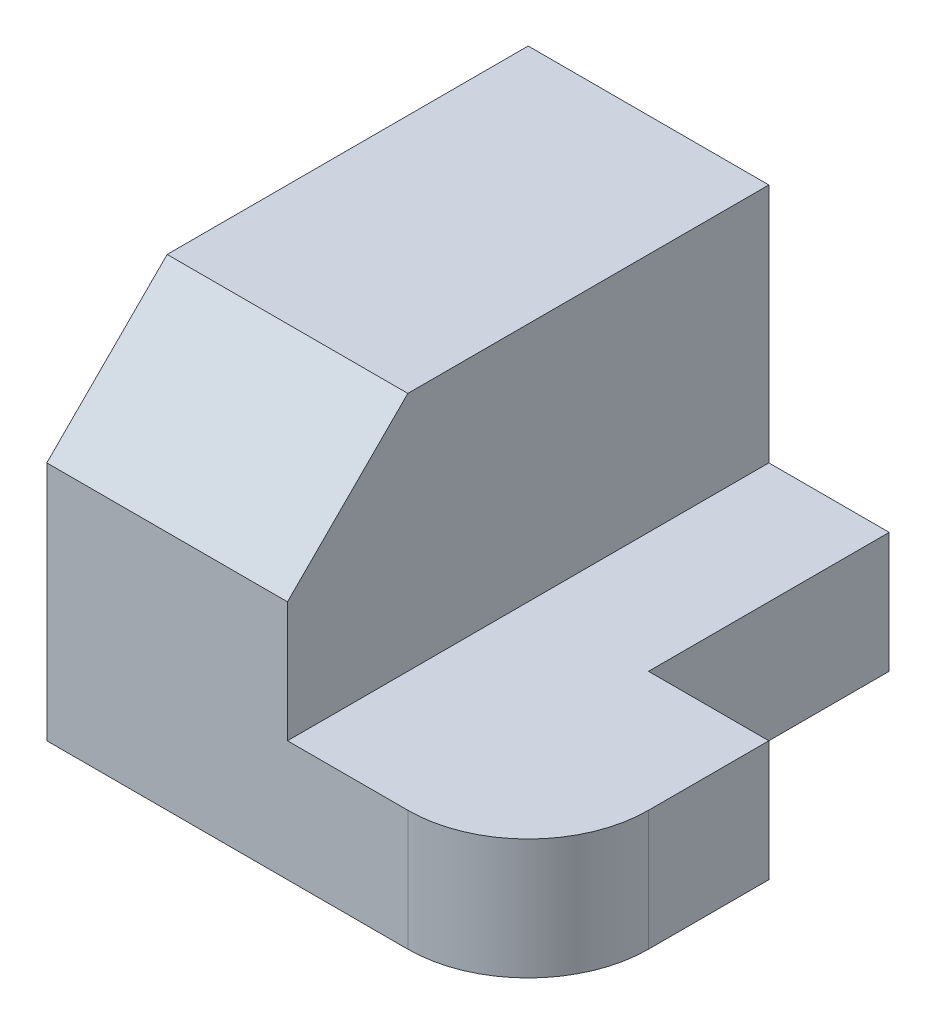
ISO-10303-21;
HEADER;
FILE_DESCRIPTION(('STEP AP214'),'2;1');
FILE_NAME('part.step','',(''),(''),'','','');
FILE_SCHEMA(('AUTOMOTIVE_DESIGN { 1 0 10303 214 1 1 1 1 }'));
ENDSEC;
DATA;
#1=APPLICATION_CONTEXT('core data for automotive mechanical design processes');
#2=APPLICATION_PROTOCOL_DEFINITION('international standard','automotive_design',2000,#1);
#3=PRODUCT_CONTEXT('',#1,'mechanical');
#4=PRODUCT('Part','Part','',(#3));
#5=PRODUCT_RELATED_PRODUCT_CATEGORY('part','',(#4));
#6=PRODUCT_DEFINITION_FORMATION('','',#4);
#7=PRODUCT_DEFINITION_CONTEXT('part definition',#1,'design');
#8=PRODUCT_DEFINITION('design','',#6,#7);
#9=PRODUCT_DEFINITION_SHAPE('','',#8);
#10=(LENGTH_UNIT() NAMED_UNIT(*) SI_UNIT(.MILLI.,.METRE.));
#11=(NAMED_UNIT(*) PLANE_ANGLE_UNIT() SI_UNIT($,.RADIAN.));
#12=(NAMED_UNIT(*) SI_UNIT($,.STERADIAN.) SOLID_ANGLE_UNIT());
#13=UNCERTAINTY_MEASURE_WITH_UNIT(LENGTH_MEASURE(1.E-05),#10,'distance_accuracy_value','');
#14=(GEOMETRIC_REPRESENTATION_CONTEXT(3) GLOBAL_UNCERTAINTY_ASSIGNED_CONTEXT((#13)) GLOBAL_UNIT_ASSIGNED_CONTEXT((#10,
#11,#12)) REPRESENTATION_CONTEXT('',''));
#15=CARTESIAN_POINT('',(0.,0.,0.));
#16=DIRECTION('',(0.,0.,1.));
#17=DIRECTION('',(1.,0.,0.));
#18=AXIS2_PLACEMENT_3D('',#15,#16,#17);
#19=CARTESIAN_POINT('',(-20.,20.,0.));
#20=DIRECTION('',(1.,0.,0.));
#21=DIRECTION('',(0.,0.,-1.));
#22=AXIS2_PLACEMENT_3D('',#19,#20,#21);
#23=PLANE('',#22);
#24=DIRECTION('',(0.,-1.,0.));
#25=VECTOR('',#24,1.);
#26=CARTESIAN_POINT('',(-20.,20.,0.));
#27=LINE('',#26,#25);
#28=CARTESIAN_POINT('',(-20.,20.,0.));
#29=VERTEX_POINT('',#28);
#30=CARTESIAN_POINT('',(-20.,0.,0.));
#31=VERTEX_POINT('',#30);
#32=EDGE_CURVE('E130',#29,#31,#27,.T.);
#33=ORIENTED_EDGE('',*,*,#32,.F.);
#34=DIRECTION('',(0.,-0.707106781186547,0.707106781186548));
#35=VECTOR('',#34,1.);
#36=CARTESIAN_POINT('',(-20.,30.,-10.));
#37=LINE('',#36,#35);
#38=CARTESIAN_POINT('',(-20.,30.,-10.));
#39=VERTEX_POINT('',#38);
#40=EDGE_CURVE('E116',#39,#29,#37,.T.);
#41=ORIENTED_EDGE('',*,*,#40,.F.);
#42=DIRECTION('',(0.,0.,1.));
#43=VECTOR('',#42,1.);
#44=CARTESIAN_POINT('',(-20.,30.,0.));
#45=LINE('',#44,#43);
#46=CARTESIAN_POINT('',(-20.,30.,-40.));
#47=VERTEX_POINT('',#46);
#48=EDGE_CURVE('E124',#47,#39,#45,.T.);
#49=ORIENTED_EDGE('',*,*,#48,.F.);
#50=DIRECTION('',(0.,-1.,0.));
#51=VECTOR('',#50,1.);
#52=CARTESIAN_POINT('',(-20.,30.,-40.));
#53=LINE('',#52,#51);
#54=CARTESIAN_POINT('',(-20.,0.,-40.));
#55=VERTEX_POINT('',#54);
#56=EDGE_CURVE('E142',#47,#55,#53,.T.);
#57=ORIENTED_EDGE('',*,*,#56,.T.);
#58=DIRECTION('',(0.,0.,1.));
#59=VECTOR('',#58,1.);
#60=CARTESIAN_POINT('',(-20.,0.,0.));
#61=LINE('',#60,#59);
#62=EDGE_CURVE('E181',#55,#31,#61,.T.);
#63=ORIENTED_EDGE('',*,*,#62,.T.);
#64=EDGE_LOOP('',(#33,#41,#49,#57,#63));
#65=FACE_BOUND('',#64,.T.);
#66=ADVANCED_FACE('F37',(#65),#23,.F.);
#67=CARTESIAN_POINT('',(0.,20.,0.));
#68=DIRECTION('',(0.,0.,-1.));
#69=DIRECTION('',(-1.,0.,0.));
#70=AXIS2_PLACEMENT_3D('',#67,#68,#69);
#71=PLANE('',#70);
#72=DIRECTION('',(1.,0.,0.));
#73=VECTOR('',#72,1.);
#74=CARTESIAN_POINT('',(0.,0.,0.));
#75=LINE('',#74,#73);
#76=CARTESIAN_POINT('',(10.,0.,0.));
#77=VERTEX_POINT('',#76);
#78=EDGE_CURVE('E185',#31,#77,#75,.T.);
#79=ORIENTED_EDGE('',*,*,#78,.T.);
#80=DIRECTION('',(0.,-1.,0.));
#81=VECTOR('',#80,1.);
#82=CARTESIAN_POINT('',(10.,10.,0.));
#83=LINE('',#82,#81);
#84=CARTESIAN_POINT('',(10.,10.,0.));
#85=VERTEX_POINT('',#84);
#86=EDGE_CURVE('E45',#77,#85,#83,.F.);
#87=ORIENTED_EDGE('',*,*,#86,.T.);
#88=DIRECTION('',(1.,0.,0.));
#89=VECTOR('',#88,1.);
#90=CARTESIAN_POINT('',(0.,10.,0.));
#91=LINE('',#90,#89);
#92=CARTESIAN_POINT('',(0.,10.,0.));
#93=VERTEX_POINT('',#92);
#94=EDGE_CURVE('E151',#93,#85,#91,.T.);
#95=ORIENTED_EDGE('',*,*,#94,.F.);
#96=DIRECTION('',(0.,-1.,0.));
#97=VECTOR('',#96,1.);
#98=CARTESIAN_POINT('',(0.,20.,0.));
#99=LINE('',#98,#97);
#100=CARTESIAN_POINT('',(0.,20.,0.));
#101=VERTEX_POINT('',#100);
#102=EDGE_CURVE('E184',#101,#93,#99,.T.);
#103=ORIENTED_EDGE('',*,*,#102,.F.);
#104=DIRECTION('',(1.,0.,0.));
#105=VECTOR('',#104,1.);
#106=CARTESIAN_POINT('',(0.,20.,0.));
#107=LINE('',#106,#105);
#108=EDGE_CURVE('E182',#29,#101,#107,.T.);
#109=ORIENTED_EDGE('',*,*,#108,.F.);
#110=ORIENTED_EDGE('',*,*,#32,.T.);
#111=EDGE_LOOP('',(#79,#87,#95,#103,#109,#110));
#112=FACE_BOUND('',#111,.T.);
#113=ADVANCED_FACE('F216',(#112),#71,.F.);
#114=CARTESIAN_POINT('',(0.,20.,0.));
#115=DIRECTION('',(-1.,0.,0.));
#116=DIRECTION('',(0.,0.,1.));
#117=AXIS2_PLACEMENT_3D('',#114,#115,#116);
#118=PLANE('',#117);
#119=ORIENTED_EDGE('',*,*,#102,.T.);
#120=DIRECTION('',(0.,0.,-1.));
#121=VECTOR('',#120,1.);
#122=CARTESIAN_POINT('',(0.,10.,0.));
#123=LINE('',#122,#121);
#124=CARTESIAN_POINT('',(0.,10.,-40.));
#125=VERTEX_POINT('',#124);
#126=EDGE_CURVE('E148',#93,#125,#123,.T.);
#127=ORIENTED_EDGE('',*,*,#126,.T.);
#128=DIRECTION('',(0.,-1.,0.));
#129=VECTOR('',#128,1.);
#130=CARTESIAN_POINT('',(0.,30.,-40.));
#131=LINE('',#130,#129);
#132=CARTESIAN_POINT('',(0.,30.,-40.));
#133=VERTEX_POINT('',#132);
#134=EDGE_CURVE('E144',#133,#125,#131,.T.);
#135=ORIENTED_EDGE('',*,*,#134,.F.);
#136=DIRECTION('',(0.,0.,-1.));
#137=VECTOR('',#136,1.);
#138=CARTESIAN_POINT('',(0.,30.,0.));
#139=LINE('',#138,#137);
#140=CARTESIAN_POINT('',(0.,30.,-10.));
#141=VERTEX_POINT('',#140);
#142=EDGE_CURVE('E123',#141,#133,#139,.T.);
#143=ORIENTED_EDGE('',*,*,#142,.F.);
#144=DIRECTION('',(0.,-0.707106781186547,0.707106781186548));
#145=VECTOR('',#144,1.);
#146=CARTESIAN_POINT('',(0.,30.,-10.));
#147=LINE('',#146,#145);
#148=EDGE_CURVE('E119',#141,#101,#147,.T.);
#149=ORIENTED_EDGE('',*,*,#148,.T.);
#150=EDGE_LOOP('',(#119,#127,#135,#143,#149));
#151=FACE_BOUND('',#150,.T.);
#152=ADVANCED_FACE('F220',(#151),#118,.F.);
#153=CARTESIAN_POINT('',(0.,0.,0.));
#154=DIRECTION('',(0.,1.,0.));
#155=DIRECTION('',(0.,0.,1.));
#156=AXIS2_PLACEMENT_3D('',#153,#154,#155);
#157=PLANE('',#156);
#158=DIRECTION('',(0.,0.,1.));
#159=VECTOR('',#158,1.);
#160=CARTESIAN_POINT('',(20.,0.,0.));
#161=LINE('',#160,#159);
#162=CARTESIAN_POINT('',(20.,0.,-20.));
#163=VERTEX_POINT('',#162);
#164=CARTESIAN_POINT('',(20.,0.,-10.));
#165=VERTEX_POINT('',#164);
#166=EDGE_CURVE('E147',#163,#165,#161,.T.);
#167=ORIENTED_EDGE('',*,*,#166,.T.);
#168=CARTESIAN_POINT('',(10.,0.,-10.));
#169=DIRECTION('',(0.,1.,0.));
#170=DIRECTION('',(0.,0.,1.));
#171=AXIS2_PLACEMENT_3D('',#168,#169,#170);
#172=CIRCLE('',#171,10.);
#173=EDGE_CURVE('E59',#165,#77,#172,.F.);
#174=ORIENTED_EDGE('',*,*,#173,.T.);
#175=ORIENTED_EDGE('',*,*,#78,.F.);
#176=ORIENTED_EDGE('',*,*,#62,.F.);
#177=DIRECTION('',(1.,0.,0.));
#178=VECTOR('',#177,1.);
#179=CARTESIAN_POINT('',(0.,0.,-40.));
#180=LINE('',#179,#178);
#181=CARTESIAN_POINT('',(10.,0.,-40.));
#182=VERTEX_POINT('',#181);
#183=EDGE_CURVE('E152',#55,#182,#180,.T.);
#184=ORIENTED_EDGE('',*,*,#183,.T.);
#185=DIRECTION('',(0.,0.,1.));
#186=VECTOR('',#185,1.);
#187=CARTESIAN_POINT('',(10.,0.,0.));
#188=LINE('',#187,#186);
#189=CARTESIAN_POINT('',(10.,0.,-20.));
#190=VERTEX_POINT('',#189);
#191=EDGE_CURVE('E171',#182,#190,#188,.T.);
#192=ORIENTED_EDGE('',*,*,#191,.T.);
#193=DIRECTION('',(1.,0.,0.));
#194=VECTOR('',#193,1.);
#195=CARTESIAN_POINT('',(0.,0.,-20.));
#196=LINE('',#195,#194);
#197=EDGE_CURVE('E168',#190,#163,#196,.T.);
#198=ORIENTED_EDGE('',*,*,#197,.T.);
#199=EDGE_LOOP('',(#167,#174,#175,#176,#184,#192,#198));
#200=FACE_BOUND('',#199,.T.);
#201=ADVANCED_FACE('F201',(#200),#157,.F.);
#202=CARTESIAN_POINT('',(20.,10.,0.));
#203=DIRECTION('',(1.,0.,0.));
#204=DIRECTION('',(0.,0.,-1.));
#205=AXIS2_PLACEMENT_3D('',#202,#203,#204);
#206=PLANE('',#205);
#207=DIRECTION('',(0.,0.,1.));
#208=VECTOR('',#207,1.);
#209=CARTESIAN_POINT('',(20.,10.,0.));
#210=LINE('',#209,#208);
#211=CARTESIAN_POINT('',(20.,10.,-20.));
#212=VERTEX_POINT('',#211);
#213=CARTESIAN_POINT('',(20.,10.,-10.));
#214=VERTEX_POINT('',#213);
#215=EDGE_CURVE('E154',#212,#214,#210,.T.);
#216=ORIENTED_EDGE('',*,*,#215,.T.);
#217=DIRECTION('',(0.,-1.,0.));
#218=VECTOR('',#217,1.);
#219=CARTESIAN_POINT('',(20.,0.,-10.));
#220=LINE('',#219,#218);
#221=EDGE_CURVE('E191',#214,#165,#220,.T.);
#222=ORIENTED_EDGE('',*,*,#221,.T.);
#223=ORIENTED_EDGE('',*,*,#166,.F.);
#224=DIRECTION('',(0.,-1.,0.));
#225=VECTOR('',#224,1.);
#226=CARTESIAN_POINT('',(20.,10.,-20.));
#227=LINE('',#226,#225);
#228=EDGE_CURVE('E179',#212,#163,#227,.T.);
#229=ORIENTED_EDGE('',*,*,#228,.F.);
#230=EDGE_LOOP('',(#216,#222,#223,#229));
#231=FACE_BOUND('',#230,.T.);
#232=ADVANCED_FACE('F197',(#231),#206,.T.);
#233=CARTESIAN_POINT('',(0.,10.,-20.));
#234=DIRECTION('',(0.,0.,-1.));
#235=DIRECTION('',(-1.,0.,0.));
#236=AXIS2_PLACEMENT_3D('',#233,#234,#235);
#237=PLANE('',#236);
#238=ORIENTED_EDGE('',*,*,#197,.F.);
#239=DIRECTION('',(0.,-1.,0.));
#240=VECTOR('',#239,1.);
#241=CARTESIAN_POINT('',(10.,10.,-20.));
#242=LINE('',#241,#240);
#243=CARTESIAN_POINT('',(10.,10.,-20.));
#244=VERTEX_POINT('',#243);
#245=EDGE_CURVE('E177',#244,#190,#242,.T.);
#246=ORIENTED_EDGE('',*,*,#245,.F.);
#247=DIRECTION('',(1.,0.,0.));
#248=VECTOR('',#247,1.);
#249=CARTESIAN_POINT('',(0.,10.,-20.));
#250=LINE('',#249,#248);
#251=EDGE_CURVE('E157',#244,#212,#250,.T.);
#252=ORIENTED_EDGE('',*,*,#251,.T.);
#253=ORIENTED_EDGE('',*,*,#228,.T.);
#254=EDGE_LOOP('',(#238,#246,#252,#253));
#255=FACE_BOUND('',#254,.T.);
#256=ADVANCED_FACE('F205',(#255),#237,.T.);
#257=CARTESIAN_POINT('',(10.,10.,0.));
#258=DIRECTION('',(1.,0.,0.));
#259=DIRECTION('',(0.,0.,-1.));
#260=AXIS2_PLACEMENT_3D('',#257,#258,#259);
#261=PLANE('',#260);
#262=ORIENTED_EDGE('',*,*,#191,.F.);
#263=DIRECTION('',(0.,-1.,0.));
#264=VECTOR('',#263,1.);
#265=CARTESIAN_POINT('',(10.,10.,-40.));
#266=LINE('',#265,#264);
#267=CARTESIAN_POINT('',(10.,10.,-40.));
#268=VERTEX_POINT('',#267);
#269=EDGE_CURVE('E166',#268,#182,#266,.T.);
#270=ORIENTED_EDGE('',*,*,#269,.F.);
#271=DIRECTION('',(0.,0.,1.));
#272=VECTOR('',#271,1.);
#273=CARTESIAN_POINT('',(10.,10.,0.));
#274=LINE('',#273,#272);
#275=EDGE_CURVE('E160',#268,#244,#274,.T.);
#276=ORIENTED_EDGE('',*,*,#275,.T.);
#277=ORIENTED_EDGE('',*,*,#245,.T.);
#278=EDGE_LOOP('',(#262,#270,#276,#277));
#279=FACE_BOUND('',#278,.T.);
#280=ADVANCED_FACE('F232',(#279),#261,.T.);
#281=CARTESIAN_POINT('',(0.,10.,-40.));
#282=DIRECTION('',(0.,0.,-1.));
#283=DIRECTION('',(-1.,0.,0.));
#284=AXIS2_PLACEMENT_3D('',#281,#282,#283);
#285=PLANE('',#284);
#286=ORIENTED_EDGE('',*,*,#183,.F.);
#287=ORIENTED_EDGE('',*,*,#56,.F.);
#288=DIRECTION('',(-1.,0.,0.));
#289=VECTOR('',#288,1.);
#290=CARTESIAN_POINT('',(0.,30.,-40.));
#291=LINE('',#290,#289);
#292=EDGE_CURVE('E135',#133,#47,#291,.T.);
#293=ORIENTED_EDGE('',*,*,#292,.F.);
#294=ORIENTED_EDGE('',*,*,#134,.T.);
#295=DIRECTION('',(1.,0.,0.));
#296=VECTOR('',#295,1.);
#297=CARTESIAN_POINT('',(0.,10.,-40.));
#298=LINE('',#297,#296);
#299=EDGE_CURVE('E163',#125,#268,#298,.T.);
#300=ORIENTED_EDGE('',*,*,#299,.T.);
#301=ORIENTED_EDGE('',*,*,#269,.T.);
#302=EDGE_LOOP('',(#286,#287,#293,#294,#300,#301));
#303=FACE_BOUND('',#302,.T.);
#304=ADVANCED_FACE('F235',(#303),#285,.T.);
#305=CARTESIAN_POINT('',(0.,10.,0.));
#306=DIRECTION('',(0.,1.,0.));
#307=DIRECTION('',(0.,0.,1.));
#308=AXIS2_PLACEMENT_3D('',#305,#306,#307);
#309=PLANE('',#308);
#310=ORIENTED_EDGE('',*,*,#94,.T.);
#311=CARTESIAN_POINT('',(10.,10.,-10.));
#312=DIRECTION('',(0.,1.,0.));
#313=DIRECTION('',(0.,0.,1.));
#314=AXIS2_PLACEMENT_3D('',#311,#312,#313);
#315=CIRCLE('',#314,10.);
#316=EDGE_CURVE('E11',#85,#214,#315,.T.);
#317=ORIENTED_EDGE('',*,*,#316,.T.);
#318=ORIENTED_EDGE('',*,*,#215,.F.);
#319=ORIENTED_EDGE('',*,*,#251,.F.);
#320=ORIENTED_EDGE('',*,*,#275,.F.);
#321=ORIENTED_EDGE('',*,*,#299,.F.);
#322=ORIENTED_EDGE('',*,*,#126,.F.);
#323=EDGE_LOOP('',(#310,#317,#318,#319,#320,#321,#322));
#324=FACE_BOUND('',#323,.T.);
#325=ADVANCED_FACE('F208',(#324),#309,.T.);
#326=CARTESIAN_POINT('',(0.,30.,0.));
#327=DIRECTION('',(0.,1.,0.));
#328=DIRECTION('',(0.,0.,1.));
#329=AXIS2_PLACEMENT_3D('',#326,#327,#328);
#330=PLANE('',#329);
#331=ORIENTED_EDGE('',*,*,#48,.T.);
#332=DIRECTION('',(1.,0.,0.));
#333=VECTOR('',#332,1.);
#334=CARTESIAN_POINT('',(0.,30.,-10.));
#335=LINE('',#334,#333);
#336=EDGE_CURVE('E113',#39,#141,#335,.T.);
#337=ORIENTED_EDGE('',*,*,#336,.T.);
#338=ORIENTED_EDGE('',*,*,#142,.T.);
#339=ORIENTED_EDGE('',*,*,#292,.T.);
#340=EDGE_LOOP('',(#331,#337,#338,#339));
#341=FACE_BOUND('',#340,.T.);
#342=ADVANCED_FACE('F133',(#341),#330,.T.);
#343=CARTESIAN_POINT('',(-20.,30.,-10.));
#344=DIRECTION('',(0.,0.707106781186548,0.707106781186547));
#345=DIRECTION('',(0.,-0.707106781186547,0.707106781186548));
#346=AXIS2_PLACEMENT_3D('',#343,#344,#345);
#347=PLANE('',#346);
#348=ORIENTED_EDGE('',*,*,#148,.F.);
#349=ORIENTED_EDGE('',*,*,#336,.F.);
#350=ORIENTED_EDGE('',*,*,#40,.T.);
#351=ORIENTED_EDGE('',*,*,#108,.T.);
#352=EDGE_LOOP('',(#348,#349,#350,#351));
#353=FACE_BOUND('',#352,.T.);
#354=ADVANCED_FACE('F115',(#353),#347,.T.);
#355=CARTESIAN_POINT('',(10.,10.,-10.));
#356=DIRECTION('',(0.,1.,0.));
#357=DIRECTION('',(0.,0.,1.));
#358=AXIS2_PLACEMENT_3D('',#355,#356,#357);
#359=CYLINDRICAL_SURFACE('',#358,10.);
#360=ORIENTED_EDGE('',*,*,#316,.F.);
#361=ORIENTED_EDGE('',*,*,#86,.F.);
#362=ORIENTED_EDGE('',*,*,#173,.F.);
#363=ORIENTED_EDGE('',*,*,#221,.F.);
#364=EDGE_LOOP('',(#360,#361,#362,#363));
#365=FACE_BOUND('',#364,.T.);
#366=ADVANCED_FACE('F39',(#365),#359,.T.);
#367=CLOSED_SHELL('',(#66,#113,#152,#201,#232,#256,#280,#304,#325,#342,#354,#366));
#368=MANIFOLD_SOLID_BREP('B2',#367);
#369=ADVANCED_BREP_SHAPE_REPRESENTATION('',(#18,#368),#14);
#370=SHAPE_DEFINITION_REPRESENTATION(#9,#369);
ENDSEC;
END-ISO-10303-21;
